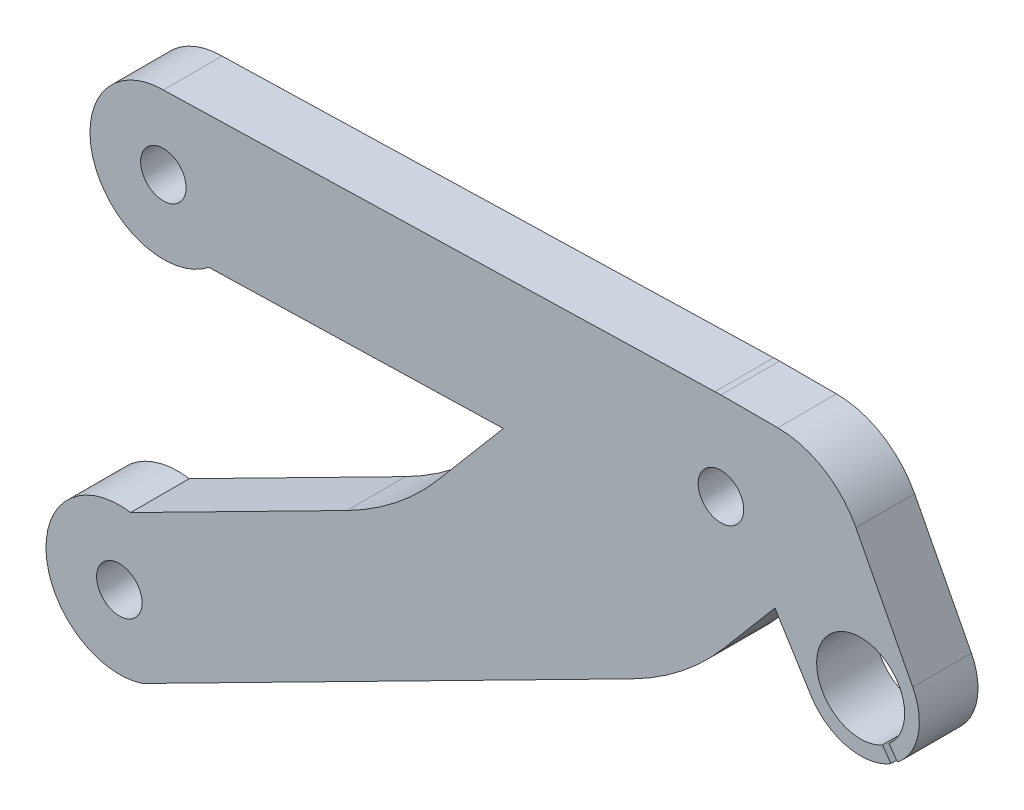
ISO-10303-21;
HEADER;
FILE_DESCRIPTION(('STEP AP214'),'2;1');
FILE_NAME('part.step','',(''),(''),'','','');
FILE_SCHEMA(('AUTOMOTIVE_DESIGN { 1 0 10303 214 1 1 1 1 }'));
ENDSEC;
DATA;
#1=APPLICATION_CONTEXT('core data for automotive mechanical design processes');
#2=APPLICATION_PROTOCOL_DEFINITION('international standard','automotive_design',2000,#1);
#3=PRODUCT_CONTEXT('',#1,'mechanical');
#4=PRODUCT('Part','Part','',(#3));
#5=PRODUCT_RELATED_PRODUCT_CATEGORY('part','',(#4));
#6=PRODUCT_DEFINITION_FORMATION('','',#4);
#7=PRODUCT_DEFINITION_CONTEXT('part definition',#1,'design');
#8=PRODUCT_DEFINITION('design','',#6,#7);
#9=PRODUCT_DEFINITION_SHAPE('','',#8);
#10=(LENGTH_UNIT() NAMED_UNIT(*) SI_UNIT(.MILLI.,.METRE.));
#11=(NAMED_UNIT(*) PLANE_ANGLE_UNIT() SI_UNIT($,.RADIAN.));
#12=(NAMED_UNIT(*) SI_UNIT($,.STERADIAN.) SOLID_ANGLE_UNIT());
#13=UNCERTAINTY_MEASURE_WITH_UNIT(LENGTH_MEASURE(1.E-05),#10,'distance_accuracy_value','');
#14=(GEOMETRIC_REPRESENTATION_CONTEXT(3) GLOBAL_UNCERTAINTY_ASSIGNED_CONTEXT((#13)) GLOBAL_UNIT_ASSIGNED_CONTEXT((#10,
#11,#12)) REPRESENTATION_CONTEXT('',''));
#15=CARTESIAN_POINT('',(0.,0.,0.));
#16=DIRECTION('',(0.,0.,1.));
#17=DIRECTION('',(1.,0.,0.));
#18=AXIS2_PLACEMENT_3D('',#15,#16,#17);
#19=CARTESIAN_POINT('',(41.,26.,-2.));
#20=DIRECTION('',(0.,0.,1.));
#21=DIRECTION('',(1.,0.,0.));
#22=AXIS2_PLACEMENT_3D('',#19,#20,#21);
#23=CYLINDRICAL_SURFACE('',#22,6.);
#24=DIRECTION('',(0.,0.,1.));
#25=VECTOR('',#24,1.);
#26=CARTESIAN_POINT('',(41.0013981333607,31.9999998371019,-23.3711254999853));
#27=LINE('',#26,#25);
#28=CARTESIAN_POINT('',(41.0013981333607,31.9999998371019,-2.));
#29=VERTEX_POINT('',#28);
#30=CARTESIAN_POINT('',(41.0013981333607,31.9999998371019,2.));
#31=VERTEX_POINT('',#30);
#32=EDGE_CURVE('E255',#29,#31,#27,.T.);
#33=ORIENTED_EDGE('',*,*,#32,.F.);
#34=CARTESIAN_POINT('',(41.,26.,-2.));
#35=DIRECTION('',(0.,0.,1.));
#36=DIRECTION('',(1.,0.,0.));
#37=AXIS2_PLACEMENT_3D('',#34,#35,#36);
#38=CIRCLE('',#37,6.);
#39=CARTESIAN_POINT('',(40.5908963470243,31.9860366020533,-2.));
#40=VERTEX_POINT('',#39);
#41=EDGE_CURVE('E214',#29,#40,#38,.T.);
#42=ORIENTED_EDGE('',*,*,#41,.T.);
#43=DIRECTION('',(0.,0.,1.));
#44=VECTOR('',#43,1.);
#45=CARTESIAN_POINT('',(40.5908963470243,31.9860366020533,-2.));
#46=LINE('',#45,#44);
#47=CARTESIAN_POINT('',(40.5908963470243,31.9860366020533,2.));
#48=VERTEX_POINT('',#47);
#49=EDGE_CURVE('E196',#40,#48,#46,.T.);
#50=ORIENTED_EDGE('',*,*,#49,.T.);
#51=CARTESIAN_POINT('',(41.,26.,2.));
#52=DIRECTION('',(0.,0.,1.));
#53=DIRECTION('',(1.,0.,0.));
#54=AXIS2_PLACEMENT_3D('',#51,#52,#53);
#55=CIRCLE('',#54,6.);
#56=EDGE_CURVE('E190',#31,#48,#55,.T.);
#57=ORIENTED_EDGE('',*,*,#56,.F.);
#58=EDGE_LOOP('',(#33,#42,#50,#57));
#59=FACE_BOUND('',#58,.T.);
#60=ADVANCED_FACE('F35',(#59),#23,.T.);
#61=CARTESIAN_POINT('',(-0.810530748396284,30.9000470018996,-2.));
#62=DIRECTION('',(0.0262217092699197,-0.999656151865712,0.));
#63=DIRECTION('',(0.999656151865712,0.0262217092699197,0.));
#64=AXIS2_PLACEMENT_3D('',#61,#62,#63);
#65=PLANE('',#64);
#66=DIRECTION('',(0.,0.,1.));
#67=VECTOR('',#66,1.);
#68=CARTESIAN_POINT('',(3.,31.,-2.));
#69=LINE('',#68,#67);
#70=CARTESIAN_POINT('',(3.,31.,-2.));
#71=VERTEX_POINT('',#70);
#72=CARTESIAN_POINT('',(3.,31.,2.));
#73=VERTEX_POINT('',#72);
#74=EDGE_CURVE('E212',#71,#73,#69,.T.);
#75=ORIENTED_EDGE('',*,*,#74,.T.);
#76=DIRECTION('',(0.999656151865712,0.0262217092699197,0.));
#77=VECTOR('',#76,1.);
#78=CARTESIAN_POINT('',(-0.810530748396284,30.9000470018996,2.));
#79=LINE('',#78,#77);
#80=EDGE_CURVE('E282',#73,#48,#79,.T.);
#81=ORIENTED_EDGE('',*,*,#80,.T.);
#82=ORIENTED_EDGE('',*,*,#49,.F.);
#83=DIRECTION('',(0.999656151865712,0.0262217092699197,0.));
#84=VECTOR('',#83,1.);
#85=CARTESIAN_POINT('',(-0.810530748396284,30.9000470018996,-2.));
#86=LINE('',#85,#84);
#87=EDGE_CURVE('E310',#71,#40,#86,.T.);
#88=ORIENTED_EDGE('',*,*,#87,.F.);
#89=EDGE_LOOP('',(#75,#81,#82,#88));
#90=FACE_BOUND('',#89,.T.);
#91=ADVANCED_FACE('F341',(#90),#65,.F.);
#92=CARTESIAN_POINT('',(15.561290611449,-13.1634380710946,-2.));
#93=DIRECTION('',(0.763478400343073,-0.645833362570859,0.));
#94=DIRECTION('',(0.645833362570859,0.763478400343073,0.));
#95=AXIS2_PLACEMENT_3D('',#92,#93,#94);
#96=PLANE('',#95);
#97=DIRECTION('',(0.645833362570859,0.763478400343073,0.));
#98=VECTOR('',#97,1.);
#99=CARTESIAN_POINT('',(15.561290611449,-13.1634380710946,2.));
#100=LINE('',#99,#98);
#101=CARTESIAN_POINT('',(41.2064358770203,17.1532281444509,2.));
#102=VERTEX_POINT('',#101);
#103=CARTESIAN_POINT('',(44.6837485343568,21.2639682501461,2.));
#104=VERTEX_POINT('',#103);
#105=EDGE_CURVE('E184',#102,#104,#100,.T.);
#106=ORIENTED_EDGE('',*,*,#105,.F.);
#107=DIRECTION('',(0.,0.,1.));
#108=VECTOR('',#107,1.);
#109=CARTESIAN_POINT('',(41.2064358770203,17.1532281444509,-2.));
#110=LINE('',#109,#108);
#111=CARTESIAN_POINT('',(41.2064358770203,17.1532281444509,-2.));
#112=VERTEX_POINT('',#111);
#113=EDGE_CURVE('E223',#102,#112,#110,.F.);
#114=ORIENTED_EDGE('',*,*,#113,.T.);
#115=DIRECTION('',(0.645833362570859,0.763478400343073,0.));
#116=VECTOR('',#115,1.);
#117=CARTESIAN_POINT('',(15.561290611449,-13.1634380710946,-2.));
#118=LINE('',#117,#116);
#119=CARTESIAN_POINT('',(44.6837485343568,21.2639682501461,-2.));
#120=VERTEX_POINT('',#119);
#121=EDGE_CURVE('E195',#112,#120,#118,.T.);
#122=ORIENTED_EDGE('',*,*,#121,.T.);
#123=DIRECTION('',(0.,0.,1.));
#124=VECTOR('',#123,1.);
#125=CARTESIAN_POINT('',(44.6837485343568,21.2639682501461,-2.));
#126=LINE('',#125,#124);
#127=EDGE_CURVE('E175',#120,#104,#126,.T.);
#128=ORIENTED_EDGE('',*,*,#127,.T.);
#129=EDGE_LOOP('',(#106,#114,#122,#128));
#130=FACE_BOUND('',#129,.T.);
#131=ADVANCED_FACE('F193',(#130),#96,.T.);
#132=CARTESIAN_POINT('',(2.23999683430465,-4.40763390776514,-2.));
#133=DIRECTION('',(0.453058163978715,-0.891480958883719,0.));
#134=DIRECTION('',(0.891480958883719,0.453058163978715,0.));
#135=AXIS2_PLACEMENT_3D('',#132,#133,#134);
#136=PLANE('',#135);
#137=DIRECTION('',(0.891480958883719,0.453058163978715,0.));
#138=VECTOR('',#137,1.);
#139=CARTESIAN_POINT('',(2.23999683430465,-4.40763390776514,-2.));
#140=LINE('',#139,#138);
#141=CARTESIAN_POINT('',(1.57575227360064,-4.74520861208887,-2.));
#142=VERTEX_POINT('',#141);
#143=CARTESIAN_POINT('',(34.9980311497331,12.2402762181937,-2.));
#144=VERTEX_POINT('',#143);
#145=EDGE_CURVE('E327',#142,#144,#140,.T.);
#146=ORIENTED_EDGE('',*,*,#145,.T.);
#147=DIRECTION('',(0.,0.,1.));
#148=VECTOR('',#147,1.);
#149=CARTESIAN_POINT('',(34.9980311497331,12.2402762181937,-2.));
#150=LINE('',#149,#148);
#151=CARTESIAN_POINT('',(34.9980311497331,12.2402762181937,2.));
#152=VERTEX_POINT('',#151);
#153=EDGE_CURVE('E219',#144,#152,#150,.T.);
#154=ORIENTED_EDGE('',*,*,#153,.T.);
#155=DIRECTION('',(0.891480958883719,0.453058163978715,0.));
#156=VECTOR('',#155,1.);
#157=CARTESIAN_POINT('',(2.23999683430465,-4.40763390776514,2.));
#158=LINE('',#157,#156);
#159=CARTESIAN_POINT('',(1.57575227360064,-4.74520861208887,2.));
#160=VERTEX_POINT('',#159);
#161=EDGE_CURVE('E191',#160,#152,#158,.T.);
#162=ORIENTED_EDGE('',*,*,#161,.F.);
#163=DIRECTION('',(0.,0.,1.));
#164=VECTOR('',#163,1.);
#165=CARTESIAN_POINT('',(1.57575227360064,-4.74520861208887,-2.));
#166=LINE('',#165,#164);
#167=EDGE_CURVE('E197',#142,#160,#166,.T.);
#168=ORIENTED_EDGE('',*,*,#167,.F.);
#169=EDGE_LOOP('',(#146,#154,#162,#168));
#170=FACE_BOUND('',#169,.T.);
#171=ADVANCED_FACE('F405',(#170),#136,.T.);
#172=CARTESIAN_POINT('',(0.,0.,-2.));
#173=DIRECTION('',(0.,0.,1.));
#174=DIRECTION('',(1.,0.,0.));
#175=AXIS2_PLACEMENT_3D('',#172,#173,#174);
#176=CYLINDRICAL_SURFACE('',#175,5.);
#177=ORIENTED_EDGE('',*,*,#167,.T.);
#178=CARTESIAN_POINT('',(0.,0.,2.));
#179=DIRECTION('',(0.,0.,1.));
#180=DIRECTION('',(1.,0.,0.));
#181=AXIS2_PLACEMENT_3D('',#178,#179,#180);
#182=CIRCLE('',#181,5.);
#183=CARTESIAN_POINT('',(0.769235560394451,4.9404733227318,2.));
#184=VERTEX_POINT('',#183);
#185=EDGE_CURVE('E296',#184,#160,#182,.T.);
#186=ORIENTED_EDGE('',*,*,#185,.F.);
#187=DIRECTION('',(0.,0.,1.));
#188=VECTOR('',#187,1.);
#189=CARTESIAN_POINT('',(0.769235560394451,4.9404733227318,-2.));
#190=LINE('',#189,#188);
#191=CARTESIAN_POINT('',(0.769235560394451,4.9404733227318,-2.));
#192=VERTEX_POINT('',#191);
#193=EDGE_CURVE('E202',#192,#184,#190,.T.);
#194=ORIENTED_EDGE('',*,*,#193,.F.);
#195=CARTESIAN_POINT('',(0.,0.,-2.));
#196=DIRECTION('',(0.,0.,1.));
#197=DIRECTION('',(1.,0.,0.));
#198=AXIS2_PLACEMENT_3D('',#195,#196,#197);
#199=CIRCLE('',#198,5.);
#200=EDGE_CURVE('E324',#192,#142,#199,.T.);
#201=ORIENTED_EDGE('',*,*,#200,.T.);
#202=EDGE_LOOP('',(#177,#186,#194,#201));
#203=FACE_BOUND('',#202,.T.);
#204=ADVANCED_FACE('F408',(#203),#176,.T.);
#205=CARTESIAN_POINT('',(-1.83752664150379,3.61569472218833,-2.));
#206=DIRECTION('',(-0.453058163978715,0.891480958883719,0.));
#207=DIRECTION('',(-0.891480958883719,-0.453058163978715,0.));
#208=AXIS2_PLACEMENT_3D('',#205,#206,#207);
#209=PLANE('',#208);
#210=DIRECTION('',(-0.891480958883719,-0.453058163978716,0.));
#211=VECTOR('',#210,1.);
#212=CARTESIAN_POINT('',(-1.83752664150379,3.61569472218833,2.));
#213=LINE('',#212,#211);
#214=CARTESIAN_POINT('',(15.5155564253994,12.434678319444,2.));
#215=VERTEX_POINT('',#214);
#216=EDGE_CURVE('E294',#215,#184,#213,.T.);
#217=ORIENTED_EDGE('',*,*,#216,.F.);
#218=DIRECTION('',(0.,0.,1.));
#219=VECTOR('',#218,1.);
#220=CARTESIAN_POINT('',(15.5155564253994,12.434678319444,-2.));
#221=LINE('',#220,#219);
#222=CARTESIAN_POINT('',(15.5155564253994,12.434678319444,-2.));
#223=VERTEX_POINT('',#222);
#224=EDGE_CURVE('E217',#215,#223,#221,.F.);
#225=ORIENTED_EDGE('',*,*,#224,.T.);
#226=DIRECTION('',(-0.891480958883719,-0.453058163978716,0.));
#227=VECTOR('',#226,1.);
#228=CARTESIAN_POINT('',(-1.83752664150379,3.61569472218833,-2.));
#229=LINE('',#228,#227);
#230=EDGE_CURVE('E322',#223,#192,#229,.T.);
#231=ORIENTED_EDGE('',*,*,#230,.T.);
#232=ORIENTED_EDGE('',*,*,#193,.T.);
#233=EDGE_LOOP('',(#217,#225,#231,#232));
#234=FACE_BOUND('',#233,.T.);
#235=ADVANCED_FACE('F412',(#234),#209,.T.);
#236=CARTESIAN_POINT('',(4.10911460630286,-3.47593763253173,-2.));
#237=DIRECTION('',(-0.763478400343073,0.645833362570859,0.));
#238=DIRECTION('',(-0.645833362570859,-0.763478400343073,0.));
#239=AXIS2_PLACEMENT_3D('',#236,#237,#238);
#240=PLANE('',#239);
#241=DIRECTION('',(-0.645833362570859,-0.763478400343073,0.));
#242=VECTOR('',#241,1.);
#243=CARTESIAN_POINT('',(4.10911460630286,-3.47593763253173,-2.));
#244=LINE('',#243,#242);
#245=CARTESIAN_POINT('',(26.1709607270067,22.6046954858943,-2.));
#246=VERTEX_POINT('',#245);
#247=CARTESIAN_POINT('',(21.7239611526865,17.3476302457012,-2.));
#248=VERTEX_POINT('',#247);
#249=EDGE_CURVE('E319',#246,#248,#244,.T.);
#250=ORIENTED_EDGE('',*,*,#249,.T.);
#251=DIRECTION('',(0.,0.,1.));
#252=VECTOR('',#251,1.);
#253=CARTESIAN_POINT('',(21.7239611526865,17.3476302457012,2.));
#254=LINE('',#253,#252);
#255=CARTESIAN_POINT('',(21.7239611526865,17.3476302457012,2.));
#256=VERTEX_POINT('',#255);
#257=EDGE_CURVE('E200',#248,#256,#254,.T.);
#258=ORIENTED_EDGE('',*,*,#257,.T.);
#259=DIRECTION('',(-0.645833362570859,-0.763478400343073,0.));
#260=VECTOR('',#259,1.);
#261=CARTESIAN_POINT('',(4.10911460630286,-3.47593763253173,2.));
#262=LINE('',#261,#260);
#263=CARTESIAN_POINT('',(26.1709607270067,22.6046954858943,2.));
#264=VERTEX_POINT('',#263);
#265=EDGE_CURVE('E291',#264,#256,#262,.T.);
#266=ORIENTED_EDGE('',*,*,#265,.F.);
#267=DIRECTION('',(0.,0.,1.));
#268=VECTOR('',#267,1.);
#269=CARTESIAN_POINT('',(26.1709607270067,22.6046954858943,-2.));
#270=LINE('',#269,#268);
#271=EDGE_CURVE('E208',#246,#264,#270,.T.);
#272=ORIENTED_EDGE('',*,*,#271,.F.);
#273=EDGE_LOOP('',(#250,#258,#266,#272));
#274=FACE_BOUND('',#273,.T.);
#275=ADVANCED_FACE('F416',(#274),#240,.T.);
#276=CARTESIAN_POINT('',(-0.574535364967009,21.9031416351081,-2.));
#277=DIRECTION('',(0.0262217092699199,-0.999656151865712,0.));
#278=DIRECTION('',(0.999656151865712,0.0262217092699199,0.));
#279=AXIS2_PLACEMENT_3D('',#276,#277,#278);
#280=PLANE('',#279);
#281=ORIENTED_EDGE('',*,*,#271,.T.);
#282=DIRECTION('',(0.999656151865712,0.0262217092699199,0.));
#283=VECTOR('',#282,1.);
#284=CARTESIAN_POINT('',(-0.574535364967009,21.9031416351081,2.));
#285=LINE('',#284,#283);
#286=CARTESIAN_POINT('',(6.10160747242444,22.0782617263513,2.));
#287=VERTEX_POINT('',#286);
#288=EDGE_CURVE('E288',#287,#264,#285,.T.);
#289=ORIENTED_EDGE('',*,*,#288,.F.);
#290=DIRECTION('',(0.,0.,1.));
#291=VECTOR('',#290,1.);
#292=CARTESIAN_POINT('',(6.10160747242444,22.0782617263513,-2.));
#293=LINE('',#292,#291);
#294=CARTESIAN_POINT('',(6.10160747242444,22.0782617263513,-2.));
#295=VERTEX_POINT('',#294);
#296=EDGE_CURVE('E210',#295,#287,#293,.T.);
#297=ORIENTED_EDGE('',*,*,#296,.F.);
#298=DIRECTION('',(0.999656151865712,0.0262217092699199,0.));
#299=VECTOR('',#298,1.);
#300=CARTESIAN_POINT('',(-0.574535364967009,21.9031416351081,-2.));
#301=LINE('',#300,#299);
#302=EDGE_CURVE('E316',#295,#246,#301,.T.);
#303=ORIENTED_EDGE('',*,*,#302,.T.);
#304=EDGE_LOOP('',(#281,#289,#297,#303));
#305=FACE_BOUND('',#304,.T.);
#306=ADVANCED_FACE('F420',(#305),#280,.T.);
#307=CARTESIAN_POINT('',(3.,26.,-2.));
#308=DIRECTION('',(0.,0.,1.));
#309=DIRECTION('',(1.,0.,0.));
#310=AXIS2_PLACEMENT_3D('',#307,#308,#309);
#311=CYLINDRICAL_SURFACE('',#310,1.54999999999999);
#312=CARTESIAN_POINT('',(3.,26.,-2.));
#313=DIRECTION('',(0.,0.,1.));
#314=DIRECTION('',(1.,0.,0.));
#315=AXIS2_PLACEMENT_3D('',#312,#313,#314);
#316=CIRCLE('',#315,1.54999999999999);
#317=CARTESIAN_POINT('',(4.54999999999999,26.,-2.));
#318=VERTEX_POINT('',#317);
#319=EDGE_CURVE('E307',#318,#318,#316,.T.);
#320=ORIENTED_EDGE('',*,*,#319,.F.);
#321=EDGE_LOOP('',(#320));
#322=FACE_BOUND('',#321,.T.);
#323=CARTESIAN_POINT('',(3.,26.,2.));
#324=DIRECTION('',(0.,0.,1.));
#325=DIRECTION('',(1.,0.,0.));
#326=AXIS2_PLACEMENT_3D('',#323,#324,#325);
#327=CIRCLE('',#326,1.54999999999999);
#328=CARTESIAN_POINT('',(4.54999999999999,26.,2.));
#329=VERTEX_POINT('',#328);
#330=EDGE_CURVE('E279',#329,#329,#327,.T.);
#331=ORIENTED_EDGE('',*,*,#330,.T.);
#332=EDGE_LOOP('',(#331));
#333=FACE_BOUND('',#332,.T.);
#334=ADVANCED_FACE('F424',(#322,#333),#311,.F.);
#335=CARTESIAN_POINT('',(41.,26.,-2.));
#336=DIRECTION('',(0.,0.,1.));
#337=DIRECTION('',(1.,0.,0.));
#338=AXIS2_PLACEMENT_3D('',#335,#336,#337);
#339=CYLINDRICAL_SURFACE('',#338,1.54999999999999);
#340=CARTESIAN_POINT('',(41.,26.,-2.));
#341=DIRECTION('',(0.,0.,1.));
#342=DIRECTION('',(1.,0.,0.));
#343=AXIS2_PLACEMENT_3D('',#340,#341,#342);
#344=CIRCLE('',#343,1.54999999999999);
#345=CARTESIAN_POINT('',(42.55,26.,-2.));
#346=VERTEX_POINT('',#345);
#347=EDGE_CURVE('E304',#346,#346,#344,.T.);
#348=ORIENTED_EDGE('',*,*,#347,.F.);
#349=EDGE_LOOP('',(#348));
#350=FACE_BOUND('',#349,.T.);
#351=CARTESIAN_POINT('',(41.,26.,2.));
#352=DIRECTION('',(0.,0.,1.));
#353=DIRECTION('',(1.,0.,0.));
#354=AXIS2_PLACEMENT_3D('',#351,#352,#353);
#355=CIRCLE('',#354,1.54999999999999);
#356=CARTESIAN_POINT('',(42.55,26.,2.));
#357=VERTEX_POINT('',#356);
#358=EDGE_CURVE('E276',#357,#357,#355,.T.);
#359=ORIENTED_EDGE('',*,*,#358,.T.);
#360=EDGE_LOOP('',(#359));
#361=FACE_BOUND('',#360,.T.);
#362=ADVANCED_FACE('F433',(#350,#361),#339,.F.);
#363=CARTESIAN_POINT('',(0.,0.,-2.));
#364=DIRECTION('',(0.,0.,1.));
#365=DIRECTION('',(1.,0.,0.));
#366=AXIS2_PLACEMENT_3D('',#363,#364,#365);
#367=CYLINDRICAL_SURFACE('',#366,1.55);
#368=CARTESIAN_POINT('',(0.,0.,-2.));
#369=DIRECTION('',(0.,0.,1.));
#370=DIRECTION('',(1.,0.,0.));
#371=AXIS2_PLACEMENT_3D('',#368,#369,#370);
#372=CIRCLE('',#371,1.55);
#373=CARTESIAN_POINT('',(1.55,0.,-2.));
#374=VERTEX_POINT('',#373);
#375=EDGE_CURVE('E301',#374,#374,#372,.T.);
#376=ORIENTED_EDGE('',*,*,#375,.F.);
#377=EDGE_LOOP('',(#376));
#378=FACE_BOUND('',#377,.T.);
#379=CARTESIAN_POINT('',(0.,0.,2.));
#380=DIRECTION('',(0.,0.,1.));
#381=DIRECTION('',(1.,0.,0.));
#382=AXIS2_PLACEMENT_3D('',#379,#380,#381);
#383=CIRCLE('',#382,1.55);
#384=CARTESIAN_POINT('',(1.55,0.,2.));
#385=VERTEX_POINT('',#384);
#386=EDGE_CURVE('E272',#385,#385,#383,.T.);
#387=ORIENTED_EDGE('',*,*,#386,.T.);
#388=EDGE_LOOP('',(#387));
#389=FACE_BOUND('',#388,.T.);
#390=ADVANCED_FACE('F428',(#378,#389),#367,.F.);
#391=CARTESIAN_POINT('',(3.,26.,-2.));
#392=DIRECTION('',(0.,0.,1.));
#393=DIRECTION('',(1.,0.,0.));
#394=AXIS2_PLACEMENT_3D('',#391,#392,#393);
#395=CYLINDRICAL_SURFACE('',#394,5.);
#396=ORIENTED_EDGE('',*,*,#296,.T.);
#397=CARTESIAN_POINT('',(3.,26.,2.));
#398=DIRECTION('',(0.,0.,1.));
#399=DIRECTION('',(1.,0.,0.));
#400=AXIS2_PLACEMENT_3D('',#397,#398,#399);
#401=CIRCLE('',#400,5.);
#402=EDGE_CURVE('E285',#73,#287,#401,.T.);
#403=ORIENTED_EDGE('',*,*,#402,.F.);
#404=ORIENTED_EDGE('',*,*,#74,.F.);
#405=CARTESIAN_POINT('',(3.,26.,-2.));
#406=DIRECTION('',(0.,0.,1.));
#407=DIRECTION('',(1.,0.,0.));
#408=AXIS2_PLACEMENT_3D('',#405,#406,#407);
#409=CIRCLE('',#408,5.);
#410=EDGE_CURVE('E313',#71,#295,#409,.T.);
#411=ORIENTED_EDGE('',*,*,#410,.T.);
#412=EDGE_LOOP('',(#396,#403,#404,#411));
#413=FACE_BOUND('',#412,.T.);
#414=ADVANCED_FACE('F426',(#413),#395,.T.);
#415=CARTESIAN_POINT('',(0.,0.,-2.));
#416=DIRECTION('',(0.,0.,1.));
#417=DIRECTION('',(1.,0.,0.));
#418=AXIS2_PLACEMENT_3D('',#415,#416,#417);
#419=PLANE('',#418);
#420=ORIENTED_EDGE('',*,*,#375,.T.);
#421=EDGE_LOOP('',(#420));
#422=FACE_BOUND('',#421,.T.);
#423=ORIENTED_EDGE('',*,*,#347,.T.);
#424=EDGE_LOOP('',(#423));
#425=FACE_BOUND('',#424,.T.);
#426=ORIENTED_EDGE('',*,*,#319,.T.);
#427=EDGE_LOOP('',(#426));
#428=FACE_BOUND('',#427,.T.);
#429=DIRECTION('',(1.,0.,0.));
#430=VECTOR('',#429,1.);
#431=CARTESIAN_POINT('',(41.0013981333607,31.9999998371019,-2.));
#432=LINE('',#431,#430);
#433=CARTESIAN_POINT('',(44.8782930471815,31.9999998371019,-2.));
#434=VERTEX_POINT('',#433);
#435=EDGE_CURVE('E273',#29,#434,#432,.T.);
#436=ORIENTED_EDGE('',*,*,#435,.T.);
#437=CARTESIAN_POINT('',(44.8782930471815,25.9999998371019,-2.));
#438=DIRECTION('',(0.,0.,1.));
#439=DIRECTION('',(1.,0.,0.));
#440=AXIS2_PLACEMENT_3D('',#437,#438,#439);
#441=CIRCLE('',#440,6.);
#442=CARTESIAN_POINT('',(50.2056318879978,28.7603369315761,-2.));
#443=VERTEX_POINT('',#442);
#444=EDGE_CURVE('E11',#434,#443,#441,.F.);
#445=ORIENTED_EDGE('',*,*,#444,.T.);
#446=DIRECTION('',(0.460056182412366,-0.887889806802714,0.));
#447=VECTOR('',#446,1.);
#448=CARTESIAN_POINT('',(48.5270148600738,31.9999998371019,-2.));
#449=LINE('',#448,#447);
#450=CARTESIAN_POINT('',(54.075615089541,21.2914260278464,-2.));
#451=VERTEX_POINT('',#450);
#452=EDGE_CURVE('E242',#443,#451,#449,.T.);
#453=ORIENTED_EDGE('',*,*,#452,.T.);
#454=CARTESIAN_POINT('',(50.5240558623302,19.451201298197,-2.));
#455=DIRECTION('',(0.,0.,1.));
#456=DIRECTION('',(1.,0.,0.));
#457=AXIS2_PLACEMENT_3D('',#454,#455,#456);
#458=CIRCLE('',#457,4.);
#459=CARTESIAN_POINT('',(53.0363376183379,16.3385753363393,-2.));
#460=VERTEX_POINT('',#459);
#461=EDGE_CURVE('E346',#451,#460,#458,.F.);
#462=ORIENTED_EDGE('',*,*,#461,.T.);
#463=DIRECTION('',(-0.573576436351053,0.819152044288987,0.));
#464=VECTOR('',#463,1.);
#465=CARTESIAN_POINT('',(52.4609765483177,17.1602761016457,-2.));
#466=LINE('',#465,#464);
#467=CARTESIAN_POINT('',(52.4609765483177,17.1602761016457,-2.));
#468=VERTEX_POINT('',#467);
#469=EDGE_CURVE('E363',#460,#468,#466,.T.);
#470=ORIENTED_EDGE('',*,*,#469,.T.);
#471=CARTESIAN_POINT('',(50.5240558623302,19.451201298197,-2.));
#472=DIRECTION('',(0.,0.,1.));
#473=DIRECTION('',(1.,0.,0.));
#474=AXIS2_PLACEMENT_3D('',#471,#472,#473);
#475=CIRCLE('',#474,3.);
#476=CARTESIAN_POINT('',(52.0143554736701,16.8475486584541,-2.));
#477=VERTEX_POINT('',#476);
#478=EDGE_CURVE('E367',#468,#477,#475,.T.);
#479=ORIENTED_EDGE('',*,*,#478,.T.);
#480=DIRECTION('',(0.573576436351053,-0.819152044288987,0.));
#481=VECTOR('',#480,1.);
#482=CARTESIAN_POINT('',(52.0143554736701,16.8475486584541,-2.));
#483=LINE('',#482,#481);
#484=CARTESIAN_POINT('',(52.5897165436903,16.0258478931477,-2.));
#485=VERTEX_POINT('',#484);
#486=EDGE_CURVE('E371',#477,#485,#483,.T.);
#487=ORIENTED_EDGE('',*,*,#486,.T.);
#488=CARTESIAN_POINT('',(50.5240558623302,19.451201298197,-2.));
#489=DIRECTION('',(0.,0.,1.));
#490=DIRECTION('',(1.,0.,0.));
#491=AXIS2_PLACEMENT_3D('',#488,#489,#490);
#492=CIRCLE('',#491,4.);
#493=CARTESIAN_POINT('',(47.1283153659329,17.3372130103563,-2.));
#494=VERTEX_POINT('',#493);
#495=EDGE_CURVE('E258',#485,#494,#492,.F.);
#496=ORIENTED_EDGE('',*,*,#495,.T.);
#497=DIRECTION('',(-0.528497071960165,0.848935124099323,0.));
#498=VECTOR('',#497,1.);
#499=CARTESIAN_POINT('',(44.6837485343568,21.2639682501461,-2.));
#500=LINE('',#499,#498);
#501=EDGE_CURVE('E270',#494,#120,#500,.T.);
#502=ORIENTED_EDGE('',*,*,#501,.T.);
#503=ORIENTED_EDGE('',*,*,#121,.F.);
#504=CARTESIAN_POINT('',(25.9368678701588,30.0698953958681,-2.));
#505=DIRECTION('',(0.,0.,1.));
#506=DIRECTION('',(1.,0.,0.));
#507=AXIS2_PLACEMENT_3D('',#504,#505,#506);
#508=CIRCLE('',#507,20.);
#509=EDGE_CURVE('E225',#112,#144,#508,.F.);
#510=ORIENTED_EDGE('',*,*,#509,.T.);
#511=ORIENTED_EDGE('',*,*,#145,.F.);
#512=ORIENTED_EDGE('',*,*,#200,.F.);
#513=ORIENTED_EDGE('',*,*,#230,.F.);
#514=CARTESIAN_POINT('',(6.45439314582508,30.2642974971184,-2.));
#515=DIRECTION('',(0.,0.,1.));
#516=DIRECTION('',(1.,0.,0.));
#517=AXIS2_PLACEMENT_3D('',#514,#515,#516);
#518=CIRCLE('',#517,20.);
#519=EDGE_CURVE('E229',#223,#248,#518,.T.);
#520=ORIENTED_EDGE('',*,*,#519,.T.);
#521=ORIENTED_EDGE('',*,*,#249,.F.);
#522=ORIENTED_EDGE('',*,*,#302,.F.);
#523=ORIENTED_EDGE('',*,*,#410,.F.);
#524=ORIENTED_EDGE('',*,*,#87,.T.);
#525=ORIENTED_EDGE('',*,*,#41,.F.);
#526=EDGE_LOOP('',(#436,#445,#453,#462,#470,#479,#487,#496,#502,#503,#510,#511,#512,#513,#520,
#521,#522,#523,#524,#525));
#527=FACE_BOUND('',#526,.T.);
#528=ADVANCED_FACE('F338',(#422,#425,#428,#527),#419,.F.);
#529=CARTESIAN_POINT('',(0.,0.,2.));
#530=DIRECTION('',(0.,0.,1.));
#531=DIRECTION('',(1.,0.,0.));
#532=AXIS2_PLACEMENT_3D('',#529,#530,#531);
#533=PLANE('',#532);
#534=ORIENTED_EDGE('',*,*,#386,.F.);
#535=EDGE_LOOP('',(#534));
#536=FACE_BOUND('',#535,.T.);
#537=ORIENTED_EDGE('',*,*,#358,.F.);
#538=EDGE_LOOP('',(#537));
#539=FACE_BOUND('',#538,.T.);
#540=ORIENTED_EDGE('',*,*,#330,.F.);
#541=EDGE_LOOP('',(#540));
#542=FACE_BOUND('',#541,.T.);
#543=DIRECTION('',(-0.460056182412366,0.887889806802714,0.));
#544=VECTOR('',#543,1.);
#545=CARTESIAN_POINT('',(48.5270148600738,31.9999998371019,2.));
#546=LINE('',#545,#544);
#547=CARTESIAN_POINT('',(54.075615089541,21.2914260278464,2.));
#548=VERTEX_POINT('',#547);
#549=CARTESIAN_POINT('',(50.2056318879978,28.7603369315761,2.));
#550=VERTEX_POINT('',#549);
#551=EDGE_CURVE('E240',#548,#550,#546,.T.);
#552=ORIENTED_EDGE('',*,*,#551,.T.);
#553=CARTESIAN_POINT('',(44.8782930471815,25.9999998371019,2.));
#554=DIRECTION('',(0.,0.,1.));
#555=DIRECTION('',(1.,0.,0.));
#556=AXIS2_PLACEMENT_3D('',#553,#554,#555);
#557=CIRCLE('',#556,6.);
#558=CARTESIAN_POINT('',(44.8782930471815,31.9999998371019,2.));
#559=VERTEX_POINT('',#558);
#560=EDGE_CURVE('E57',#550,#559,#557,.T.);
#561=ORIENTED_EDGE('',*,*,#560,.T.);
#562=DIRECTION('',(-1.,0.,0.));
#563=VECTOR('',#562,1.);
#564=CARTESIAN_POINT('',(41.0013981333607,31.9999998371019,2.));
#565=LINE('',#564,#563);
#566=EDGE_CURVE('E248',#559,#31,#565,.T.);
#567=ORIENTED_EDGE('',*,*,#566,.T.);
#568=ORIENTED_EDGE('',*,*,#56,.T.);
#569=ORIENTED_EDGE('',*,*,#80,.F.);
#570=ORIENTED_EDGE('',*,*,#402,.T.);
#571=ORIENTED_EDGE('',*,*,#288,.T.);
#572=ORIENTED_EDGE('',*,*,#265,.T.);
#573=CARTESIAN_POINT('',(6.45439314582508,30.2642974971184,2.));
#574=DIRECTION('',(0.,0.,1.));
#575=DIRECTION('',(1.,0.,0.));
#576=AXIS2_PLACEMENT_3D('',#573,#574,#575);
#577=CIRCLE('',#576,20.);
#578=EDGE_CURVE('E227',#256,#215,#577,.F.);
#579=ORIENTED_EDGE('',*,*,#578,.T.);
#580=ORIENTED_EDGE('',*,*,#216,.T.);
#581=ORIENTED_EDGE('',*,*,#185,.T.);
#582=ORIENTED_EDGE('',*,*,#161,.T.);
#583=CARTESIAN_POINT('',(25.9368678701588,30.0698953958681,2.));
#584=DIRECTION('',(0.,0.,1.));
#585=DIRECTION('',(1.,0.,0.));
#586=AXIS2_PLACEMENT_3D('',#583,#584,#585);
#587=CIRCLE('',#586,20.);
#588=EDGE_CURVE('E187',#152,#102,#587,.T.);
#589=ORIENTED_EDGE('',*,*,#588,.T.);
#590=ORIENTED_EDGE('',*,*,#105,.T.);
#591=DIRECTION('',(0.528497071960165,-0.848935124099323,0.));
#592=VECTOR('',#591,1.);
#593=CARTESIAN_POINT('',(44.6837485343568,21.2639682501461,2.));
#594=LINE('',#593,#592);
#595=CARTESIAN_POINT('',(47.1283153659329,17.3372130103563,2.));
#596=VERTEX_POINT('',#595);
#597=EDGE_CURVE('E170',#104,#596,#594,.T.);
#598=ORIENTED_EDGE('',*,*,#597,.T.);
#599=CARTESIAN_POINT('',(50.5240558623302,19.451201298197,2.));
#600=DIRECTION('',(0.,0.,1.));
#601=DIRECTION('',(1.,0.,0.));
#602=AXIS2_PLACEMENT_3D('',#599,#600,#601);
#603=CIRCLE('',#602,4.);
#604=CARTESIAN_POINT('',(52.5897165436903,16.0258478931477,2.));
#605=VERTEX_POINT('',#604);
#606=EDGE_CURVE('E181',#596,#605,#603,.T.);
#607=ORIENTED_EDGE('',*,*,#606,.T.);
#608=DIRECTION('',(-0.573576436351053,0.819152044288987,0.));
#609=VECTOR('',#608,1.);
#610=CARTESIAN_POINT('',(52.0143554736701,16.8475486584541,2.));
#611=LINE('',#610,#609);
#612=CARTESIAN_POINT('',(52.0143554736701,16.8475486584541,2.));
#613=VERTEX_POINT('',#612);
#614=EDGE_CURVE('E351',#605,#613,#611,.T.);
#615=ORIENTED_EDGE('',*,*,#614,.T.);
#616=CARTESIAN_POINT('',(50.5240558623302,19.451201298197,2.));
#617=DIRECTION('',(0.,0.,-1.));
#618=DIRECTION('',(1.,0.,0.));
#619=AXIS2_PLACEMENT_3D('',#616,#617,#618);
#620=CIRCLE('',#619,3.);
#621=CARTESIAN_POINT('',(52.4609765483177,17.1602761016457,2.));
#622=VERTEX_POINT('',#621);
#623=EDGE_CURVE('E354',#613,#622,#620,.T.);
#624=ORIENTED_EDGE('',*,*,#623,.T.);
#625=DIRECTION('',(0.573576436351053,-0.819152044288987,0.));
#626=VECTOR('',#625,1.);
#627=CARTESIAN_POINT('',(52.4609765483177,17.1602761016457,2.));
#628=LINE('',#627,#626);
#629=CARTESIAN_POINT('',(53.0363376183379,16.3385753363393,2.));
#630=VERTEX_POINT('',#629);
#631=EDGE_CURVE('E251',#622,#630,#628,.T.);
#632=ORIENTED_EDGE('',*,*,#631,.T.);
#633=CARTESIAN_POINT('',(50.5240558623302,19.451201298197,2.));
#634=DIRECTION('',(0.,0.,1.));
#635=DIRECTION('',(1.,0.,0.));
#636=AXIS2_PLACEMENT_3D('',#633,#634,#635);
#637=CIRCLE('',#636,4.);
#638=EDGE_CURVE('E247',#630,#548,#637,.T.);
#639=ORIENTED_EDGE('',*,*,#638,.T.);
#640=EDGE_LOOP('',(#552,#561,#567,#568,#569,#570,#571,#572,#579,#580,#581,#582,#589,#590,#598,
#607,#615,#624,#632,#639));
#641=FACE_BOUND('',#640,.T.);
#642=ADVANCED_FACE('F185',(#536,#539,#542,#641),#533,.T.);
#643=CARTESIAN_POINT('',(6.45439314582508,30.2642974971184,-2.));
#644=DIRECTION('',(0.,0.,-1.));
#645=DIRECTION('',(-1.,0.,0.));
#646=AXIS2_PLACEMENT_3D('',#643,#644,#645);
#647=CYLINDRICAL_SURFACE('',#646,20.);
#648=ORIENTED_EDGE('',*,*,#519,.F.);
#649=ORIENTED_EDGE('',*,*,#224,.F.);
#650=ORIENTED_EDGE('',*,*,#578,.F.);
#651=ORIENTED_EDGE('',*,*,#257,.F.);
#652=EDGE_LOOP('',(#648,#649,#650,#651));
#653=FACE_BOUND('',#652,.T.);
#654=ADVANCED_FACE('F441',(#653),#647,.F.);
#655=CARTESIAN_POINT('',(25.9368678701588,30.0698953958681,-2.));
#656=DIRECTION('',(0.,0.,1.));
#657=DIRECTION('',(1.,0.,0.));
#658=AXIS2_PLACEMENT_3D('',#655,#656,#657);
#659=CYLINDRICAL_SURFACE('',#658,20.);
#660=ORIENTED_EDGE('',*,*,#509,.F.);
#661=ORIENTED_EDGE('',*,*,#113,.F.);
#662=ORIENTED_EDGE('',*,*,#588,.F.);
#663=ORIENTED_EDGE('',*,*,#153,.F.);
#664=EDGE_LOOP('',(#660,#661,#662,#663));
#665=FACE_BOUND('',#664,.T.);
#666=ADVANCED_FACE('F443',(#665),#659,.T.);
#667=CARTESIAN_POINT('',(41.0013981333607,31.9999998371019,-23.3711254999853));
#668=DIRECTION('',(0.,1.,0.));
#669=DIRECTION('',(0.,0.,1.));
#670=AXIS2_PLACEMENT_3D('',#667,#668,#669);
#671=PLANE('',#670);
#672=ORIENTED_EDGE('',*,*,#566,.F.);
#673=DIRECTION('',(0.,0.,1.));
#674=VECTOR('',#673,1.);
#675=CARTESIAN_POINT('',(44.8782930471815,31.9999998371019,-23.3711254999853));
#676=LINE('',#675,#674);
#677=EDGE_CURVE('E43',#559,#434,#676,.F.);
#678=ORIENTED_EDGE('',*,*,#677,.T.);
#679=ORIENTED_EDGE('',*,*,#435,.F.);
#680=ORIENTED_EDGE('',*,*,#32,.T.);
#681=EDGE_LOOP('',(#672,#678,#679,#680));
#682=FACE_BOUND('',#681,.T.);
#683=ADVANCED_FACE('F344',(#682),#671,.T.);
#684=CARTESIAN_POINT('',(48.5270148600738,31.9999998371019,-23.3711254999853));
#685=DIRECTION('',(0.887889806802714,0.460056182412366,0.));
#686=DIRECTION('',(-0.460056182412366,0.887889806802714,0.));
#687=AXIS2_PLACEMENT_3D('',#684,#685,#686);
#688=PLANE('',#687);
#689=ORIENTED_EDGE('',*,*,#452,.F.);
#690=DIRECTION('',(0.,0.,1.));
#691=VECTOR('',#690,1.);
#692=CARTESIAN_POINT('',(50.2056318879978,28.7603369315761,-23.3711254999853));
#693=LINE('',#692,#691);
#694=EDGE_CURVE('E231',#443,#550,#693,.T.);
#695=ORIENTED_EDGE('',*,*,#694,.T.);
#696=ORIENTED_EDGE('',*,*,#551,.F.);
#697=DIRECTION('',(0.,0.,1.));
#698=VECTOR('',#697,1.);
#699=CARTESIAN_POINT('',(54.075615089541,21.2914260278464,-23.3711254999853));
#700=LINE('',#699,#698);
#701=EDGE_CURVE('E259',#451,#548,#700,.T.);
#702=ORIENTED_EDGE('',*,*,#701,.F.);
#703=EDGE_LOOP('',(#689,#695,#696,#702));
#704=FACE_BOUND('',#703,.T.);
#705=ADVANCED_FACE('F238',(#704),#688,.T.);
#706=CARTESIAN_POINT('',(50.5240558623302,19.451201298197,-23.3711254999853));
#707=DIRECTION('',(0.,0.,1.));
#708=DIRECTION('',(1.,0.,0.));
#709=AXIS2_PLACEMENT_3D('',#706,#707,#708);
#710=CYLINDRICAL_SURFACE('',#709,4.);
#711=ORIENTED_EDGE('',*,*,#461,.F.);
#712=ORIENTED_EDGE('',*,*,#701,.T.);
#713=ORIENTED_EDGE('',*,*,#638,.F.);
#714=DIRECTION('',(0.,0.,1.));
#715=VECTOR('',#714,1.);
#716=CARTESIAN_POINT('',(53.0363376183379,16.3385753363393,-23.3711254999853));
#717=LINE('',#716,#715);
#718=EDGE_CURVE('E261',#460,#630,#717,.T.);
#719=ORIENTED_EDGE('',*,*,#718,.F.);
#720=EDGE_LOOP('',(#711,#712,#713,#719));
#721=FACE_BOUND('',#720,.T.);
#722=ADVANCED_FACE('F366',(#721),#710,.T.);
#723=CARTESIAN_POINT('',(52.4609765483177,17.1602761016457,-23.3711254999853));
#724=DIRECTION('',(-0.819152044288987,-0.573576436351053,0.));
#725=DIRECTION('',(0.573576436351053,-0.819152044288987,0.));
#726=AXIS2_PLACEMENT_3D('',#723,#724,#725);
#727=PLANE('',#726);
#728=ORIENTED_EDGE('',*,*,#469,.F.);
#729=ORIENTED_EDGE('',*,*,#718,.T.);
#730=ORIENTED_EDGE('',*,*,#631,.F.);
#731=DIRECTION('',(0.,0.,1.));
#732=VECTOR('',#731,1.);
#733=CARTESIAN_POINT('',(52.4609765483177,17.1602761016457,-23.3711254999853));
#734=LINE('',#733,#732);
#735=EDGE_CURVE('E263',#468,#622,#734,.T.);
#736=ORIENTED_EDGE('',*,*,#735,.F.);
#737=EDGE_LOOP('',(#728,#729,#730,#736));
#738=FACE_BOUND('',#737,.T.);
#739=ADVANCED_FACE('F361',(#738),#727,.T.);
#740=CARTESIAN_POINT('',(50.5240558623302,19.451201298197,-23.3711254999853));
#741=DIRECTION('',(0.,0.,1.));
#742=DIRECTION('',(1.,0.,0.));
#743=AXIS2_PLACEMENT_3D('',#740,#741,#742);
#744=CYLINDRICAL_SURFACE('',#743,3.);
#745=ORIENTED_EDGE('',*,*,#478,.F.);
#746=ORIENTED_EDGE('',*,*,#735,.T.);
#747=ORIENTED_EDGE('',*,*,#623,.F.);
#748=DIRECTION('',(0.,0.,1.));
#749=VECTOR('',#748,1.);
#750=CARTESIAN_POINT('',(52.0143554736701,16.8475486584541,-23.3711254999853));
#751=LINE('',#750,#749);
#752=EDGE_CURVE('E265',#477,#613,#751,.T.);
#753=ORIENTED_EDGE('',*,*,#752,.F.);
#754=EDGE_LOOP('',(#745,#746,#747,#753));
#755=FACE_BOUND('',#754,.T.);
#756=ADVANCED_FACE('F384',(#755),#744,.F.);
#757=CARTESIAN_POINT('',(52.0143554736701,16.8475486584541,-23.3711254999853));
#758=DIRECTION('',(0.819152044288987,0.573576436351053,0.));
#759=DIRECTION('',(-0.573576436351053,0.819152044288987,0.));
#760=AXIS2_PLACEMENT_3D('',#757,#758,#759);
#761=PLANE('',#760);
#762=ORIENTED_EDGE('',*,*,#486,.F.);
#763=ORIENTED_EDGE('',*,*,#752,.T.);
#764=ORIENTED_EDGE('',*,*,#614,.F.);
#765=DIRECTION('',(0.,0.,1.));
#766=VECTOR('',#765,1.);
#767=CARTESIAN_POINT('',(52.5897165436903,16.0258478931477,-23.3711254999853));
#768=LINE('',#767,#766);
#769=EDGE_CURVE('E267',#485,#605,#768,.T.);
#770=ORIENTED_EDGE('',*,*,#769,.F.);
#771=EDGE_LOOP('',(#762,#763,#764,#770));
#772=FACE_BOUND('',#771,.T.);
#773=ADVANCED_FACE('F380',(#772),#761,.T.);
#774=CARTESIAN_POINT('',(50.5240558623302,19.451201298197,-23.3711254999853));
#775=DIRECTION('',(0.,0.,1.));
#776=DIRECTION('',(1.,0.,0.));
#777=AXIS2_PLACEMENT_3D('',#774,#775,#776);
#778=CYLINDRICAL_SURFACE('',#777,4.);
#779=ORIENTED_EDGE('',*,*,#495,.F.);
#780=ORIENTED_EDGE('',*,*,#769,.T.);
#781=ORIENTED_EDGE('',*,*,#606,.F.);
#782=DIRECTION('',(0.,0.,1.));
#783=VECTOR('',#782,1.);
#784=CARTESIAN_POINT('',(47.1283153659329,17.3372130103563,-23.3711254999853));
#785=LINE('',#784,#783);
#786=EDGE_CURVE('E178',#494,#596,#785,.T.);
#787=ORIENTED_EDGE('',*,*,#786,.F.);
#788=EDGE_LOOP('',(#779,#780,#781,#787));
#789=FACE_BOUND('',#788,.T.);
#790=ADVANCED_FACE('F377',(#789),#778,.T.);
#791=CARTESIAN_POINT('',(44.6837485343568,21.2639682501461,-23.3711254999853));
#792=DIRECTION('',(-0.848935124099323,-0.528497071960165,0.));
#793=DIRECTION('',(0.528497071960165,-0.848935124099323,0.));
#794=AXIS2_PLACEMENT_3D('',#791,#792,#793);
#795=PLANE('',#794);
#796=ORIENTED_EDGE('',*,*,#501,.F.);
#797=ORIENTED_EDGE('',*,*,#786,.T.);
#798=ORIENTED_EDGE('',*,*,#597,.F.);
#799=ORIENTED_EDGE('',*,*,#127,.F.);
#800=EDGE_LOOP('',(#796,#797,#798,#799));
#801=FACE_BOUND('',#800,.T.);
#802=ADVANCED_FACE('F173',(#801),#795,.T.);
#803=CARTESIAN_POINT('',(44.8782930471815,25.9999998371019,-23.3711254999853));
#804=DIRECTION('',(0.,0.,1.));
#805=DIRECTION('',(1.,0.,0.));
#806=AXIS2_PLACEMENT_3D('',#803,#804,#805);
#807=CYLINDRICAL_SURFACE('',#806,6.);
#808=ORIENTED_EDGE('',*,*,#444,.F.);
#809=ORIENTED_EDGE('',*,*,#677,.F.);
#810=ORIENTED_EDGE('',*,*,#560,.F.);
#811=ORIENTED_EDGE('',*,*,#694,.F.);
#812=EDGE_LOOP('',(#808,#809,#810,#811));
#813=FACE_BOUND('',#812,.T.);
#814=ADVANCED_FACE('F37',(#813),#807,.T.);
#815=CLOSED_SHELL('',(#60,#91,#131,#171,#204,#235,#275,#306,#334,#362,#390,#414,#528,#642,#654,
#666,#683,#705,#722,#739,#756,#773,#790,#802,#814));
#816=MANIFOLD_SOLID_BREP('B2',#815);
#817=ADVANCED_BREP_SHAPE_REPRESENTATION('',(#18,#816),#14);
#818=SHAPE_DEFINITION_REPRESENTATION(#9,#817);
ENDSEC;
END-ISO-10303-21;
